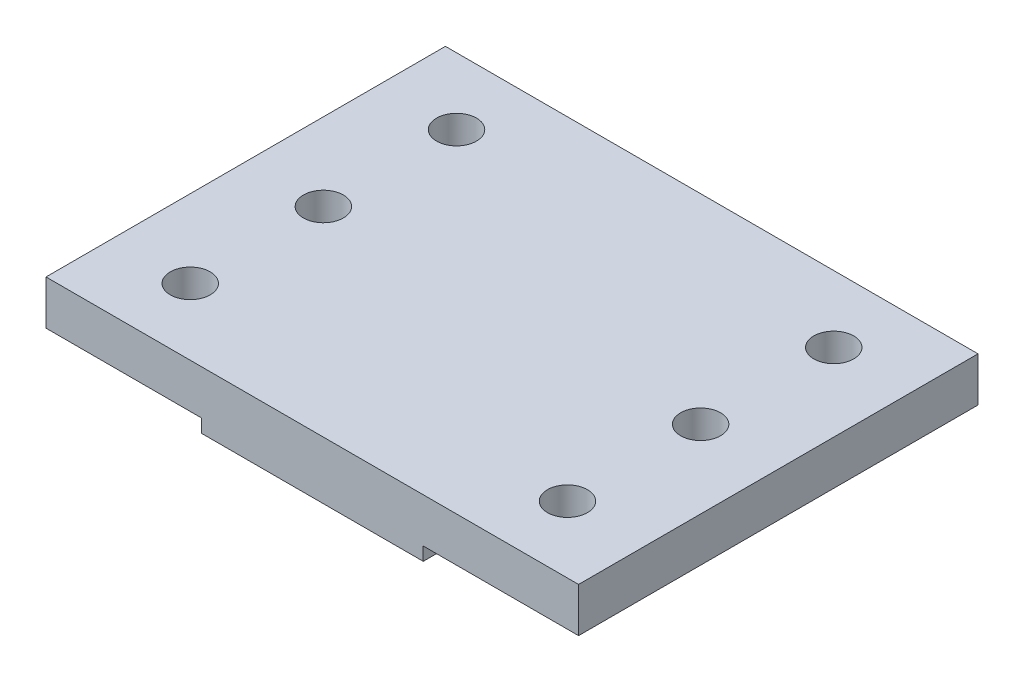
ISO-10303-21;
HEADER;
FILE_DESCRIPTION(('STEP AP214'),'2;1');
FILE_NAME('part.step','',(''),(''),'','','');
FILE_SCHEMA(('AUTOMOTIVE_DESIGN { 1 0 10303 214 1 1 1 1 }'));
ENDSEC;
DATA;
#1=APPLICATION_CONTEXT('core data for automotive mechanical design processes');
#2=APPLICATION_PROTOCOL_DEFINITION('international standard','automotive_design',2000,#1);
#3=PRODUCT_CONTEXT('',#1,'mechanical');
#4=PRODUCT('Part','Part','',(#3));
#5=PRODUCT_RELATED_PRODUCT_CATEGORY('part','',(#4));
#6=PRODUCT_DEFINITION_FORMATION('','',#4);
#7=PRODUCT_DEFINITION_CONTEXT('part definition',#1,'design');
#8=PRODUCT_DEFINITION('design','',#6,#7);
#9=PRODUCT_DEFINITION_SHAPE('','',#8);
#10=(LENGTH_UNIT() NAMED_UNIT(*) SI_UNIT(.MILLI.,.METRE.));
#11=(NAMED_UNIT(*) PLANE_ANGLE_UNIT() SI_UNIT($,.RADIAN.));
#12=(NAMED_UNIT(*) SI_UNIT($,.STERADIAN.) SOLID_ANGLE_UNIT());
#13=UNCERTAINTY_MEASURE_WITH_UNIT(LENGTH_MEASURE(1.E-05),#10,'distance_accuracy_value','');
#14=(GEOMETRIC_REPRESENTATION_CONTEXT(3) GLOBAL_UNCERTAINTY_ASSIGNED_CONTEXT((#13)) GLOBAL_UNIT_ASSIGNED_CONTEXT((#10,
#11,#12)) REPRESENTATION_CONTEXT('',''));
#15=CARTESIAN_POINT('',(0.,0.,0.));
#16=DIRECTION('',(0.,0.,1.));
#17=DIRECTION('',(1.,0.,0.));
#18=AXIS2_PLACEMENT_3D('',#15,#16,#17);
#19=CARTESIAN_POINT('',(-12.5,-2.5,45.));
#20=DIRECTION('',(0.,1.,0.));
#21=DIRECTION('',(-1.,0.,0.));
#22=AXIS2_PLACEMENT_3D('',#19,#20,#21);
#23=PLANE('',#22);
#24=CARTESIAN_POINT('',(-21.25,-2.5,37.5));
#25=DIRECTION('',(0.,1.,0.));
#26=DIRECTION('',(-1.,0.,0.));
#27=AXIS2_PLACEMENT_3D('',#24,#25,#26);
#28=CIRCLE('',#27,2.25);
#29=CARTESIAN_POINT('',(-23.5,-2.5,37.5));
#30=VERTEX_POINT('',#29);
#31=EDGE_CURVE('E185',#30,#30,#28,.T.);
#32=ORIENTED_EDGE('',*,*,#31,.T.);
#33=EDGE_LOOP('',(#32));
#34=FACE_BOUND('',#33,.T.);
#35=CARTESIAN_POINT('',(-21.25,-2.5,22.5));
#36=DIRECTION('',(0.,1.,0.));
#37=DIRECTION('',(-1.,0.,0.));
#38=AXIS2_PLACEMENT_3D('',#35,#36,#37);
#39=CIRCLE('',#38,2.25);
#40=CARTESIAN_POINT('',(-23.5,-2.5,22.5));
#41=VERTEX_POINT('',#40);
#42=EDGE_CURVE('E188',#41,#41,#39,.T.);
#43=ORIENTED_EDGE('',*,*,#42,.T.);
#44=EDGE_LOOP('',(#43));
#45=FACE_BOUND('',#44,.T.);
#46=CARTESIAN_POINT('',(-21.25,-2.5,7.5));
#47=DIRECTION('',(0.,1.,0.));
#48=DIRECTION('',(-1.,0.,0.));
#49=AXIS2_PLACEMENT_3D('',#46,#47,#48);
#50=CIRCLE('',#49,2.25);
#51=CARTESIAN_POINT('',(-23.5,-2.5,7.5));
#52=VERTEX_POINT('',#51);
#53=EDGE_CURVE('E191',#52,#52,#50,.T.);
#54=ORIENTED_EDGE('',*,*,#53,.T.);
#55=EDGE_LOOP('',(#54));
#56=FACE_BOUND('',#55,.T.);
#57=DIRECTION('',(1.,0.,0.));
#58=VECTOR('',#57,1.);
#59=CARTESIAN_POINT('',(-12.5,-2.5,0.));
#60=LINE('',#59,#58);
#61=CARTESIAN_POINT('',(-30.,-2.5,0.));
#62=VERTEX_POINT('',#61);
#63=CARTESIAN_POINT('',(-12.5,-2.5,0.));
#64=VERTEX_POINT('',#63);
#65=EDGE_CURVE('E129',#62,#64,#60,.T.);
#66=ORIENTED_EDGE('',*,*,#65,.T.);
#67=DIRECTION('',(0.,0.,-1.));
#68=VECTOR('',#67,1.);
#69=CARTESIAN_POINT('',(-12.5,-2.5,45.));
#70=LINE('',#69,#68);
#71=CARTESIAN_POINT('',(-12.5,-2.5,45.));
#72=VERTEX_POINT('',#71);
#73=EDGE_CURVE('E11',#72,#64,#70,.T.);
#74=ORIENTED_EDGE('',*,*,#73,.F.);
#75=DIRECTION('',(1.,0.,0.));
#76=VECTOR('',#75,1.);
#77=CARTESIAN_POINT('',(-12.5,-2.5,45.));
#78=LINE('',#77,#76);
#79=CARTESIAN_POINT('',(-30.,-2.5,45.));
#80=VERTEX_POINT('',#79);
#81=EDGE_CURVE('E144',#80,#72,#78,.T.);
#82=ORIENTED_EDGE('',*,*,#81,.F.);
#83=DIRECTION('',(0.,0.,-1.));
#84=VECTOR('',#83,1.);
#85=CARTESIAN_POINT('',(-30.,-2.5,45.));
#86=LINE('',#85,#84);
#87=EDGE_CURVE('E125',#80,#62,#86,.T.);
#88=ORIENTED_EDGE('',*,*,#87,.T.);
#89=EDGE_LOOP('',(#66,#74,#82,#88));
#90=FACE_BOUND('',#89,.T.);
#91=ADVANCED_FACE('F33',(#34,#45,#56,#90),#23,.F.);
#92=CARTESIAN_POINT('',(-12.5,-2.5,45.));
#93=DIRECTION('',(1.,0.,0.));
#94=DIRECTION('',(0.,0.,-1.));
#95=AXIS2_PLACEMENT_3D('',#92,#93,#94);
#96=PLANE('',#95);
#97=DIRECTION('',(0.,-1.,0.));
#98=VECTOR('',#97,1.);
#99=CARTESIAN_POINT('',(-12.5,-2.5,0.));
#100=LINE('',#99,#98);
#101=CARTESIAN_POINT('',(-12.5,-4.,0.));
#102=VERTEX_POINT('',#101);
#103=EDGE_CURVE('E132',#64,#102,#100,.T.);
#104=ORIENTED_EDGE('',*,*,#103,.T.);
#105=DIRECTION('',(0.,0.,-1.));
#106=VECTOR('',#105,1.);
#107=CARTESIAN_POINT('',(-12.5,-4.,45.));
#108=LINE('',#107,#106);
#109=CARTESIAN_POINT('',(-12.5,-4.,45.));
#110=VERTEX_POINT('',#109);
#111=EDGE_CURVE('E41',#110,#102,#108,.T.);
#112=ORIENTED_EDGE('',*,*,#111,.F.);
#113=DIRECTION('',(0.,-1.,0.));
#114=VECTOR('',#113,1.);
#115=CARTESIAN_POINT('',(-12.5,-2.5,45.));
#116=LINE('',#115,#114);
#117=EDGE_CURVE('E92',#72,#110,#116,.T.);
#118=ORIENTED_EDGE('',*,*,#117,.F.);
#119=ORIENTED_EDGE('',*,*,#73,.T.);
#120=EDGE_LOOP('',(#104,#112,#118,#119));
#121=FACE_BOUND('',#120,.T.);
#122=ADVANCED_FACE('F231',(#121),#96,.F.);
#123=CARTESIAN_POINT('',(-12.5,-4.,45.));
#124=DIRECTION('',(0.,1.,0.));
#125=DIRECTION('',(0.,0.,1.));
#126=AXIS2_PLACEMENT_3D('',#123,#124,#125);
#127=PLANE('',#126);
#128=DIRECTION('',(1.,0.,0.));
#129=VECTOR('',#128,1.);
#130=CARTESIAN_POINT('',(-12.5,-4.,0.));
#131=LINE('',#130,#129);
#132=CARTESIAN_POINT('',(12.5,-4.,0.));
#133=VERTEX_POINT('',#132);
#134=EDGE_CURVE('E135',#102,#133,#131,.T.);
#135=ORIENTED_EDGE('',*,*,#134,.T.);
#136=DIRECTION('',(0.,0.,-1.));
#137=VECTOR('',#136,1.);
#138=CARTESIAN_POINT('',(12.5,-4.,45.));
#139=LINE('',#138,#137);
#140=CARTESIAN_POINT('',(12.5,-4.,45.));
#141=VERTEX_POINT('',#140);
#142=EDGE_CURVE('E151',#141,#133,#139,.T.);
#143=ORIENTED_EDGE('',*,*,#142,.F.);
#144=DIRECTION('',(1.,0.,0.));
#145=VECTOR('',#144,1.);
#146=CARTESIAN_POINT('',(-12.5,-4.,45.));
#147=LINE('',#146,#145);
#148=EDGE_CURVE('E159',#110,#141,#147,.T.);
#149=ORIENTED_EDGE('',*,*,#148,.F.);
#150=ORIENTED_EDGE('',*,*,#111,.T.);
#151=EDGE_LOOP('',(#135,#143,#149,#150));
#152=FACE_BOUND('',#151,.T.);
#153=ADVANCED_FACE('F157',(#152),#127,.F.);
#154=CARTESIAN_POINT('',(12.5,-4.,45.));
#155=DIRECTION('',(-1.,0.,0.));
#156=DIRECTION('',(0.,0.,1.));
#157=AXIS2_PLACEMENT_3D('',#154,#155,#156);
#158=PLANE('',#157);
#159=DIRECTION('',(0.,1.,0.));
#160=VECTOR('',#159,1.);
#161=CARTESIAN_POINT('',(12.5,-4.,0.));
#162=LINE('',#161,#160);
#163=CARTESIAN_POINT('',(12.5,-2.5,0.));
#164=VERTEX_POINT('',#163);
#165=EDGE_CURVE('E137',#133,#164,#162,.T.);
#166=ORIENTED_EDGE('',*,*,#165,.T.);
#167=DIRECTION('',(0.,0.,-1.));
#168=VECTOR('',#167,1.);
#169=CARTESIAN_POINT('',(12.5,-2.5,45.));
#170=LINE('',#169,#168);
#171=CARTESIAN_POINT('',(12.5,-2.5,45.));
#172=VERTEX_POINT('',#171);
#173=EDGE_CURVE('E148',#172,#164,#170,.T.);
#174=ORIENTED_EDGE('',*,*,#173,.F.);
#175=DIRECTION('',(0.,1.,0.));
#176=VECTOR('',#175,1.);
#177=CARTESIAN_POINT('',(12.5,-4.,45.));
#178=LINE('',#177,#176);
#179=EDGE_CURVE('E171',#141,#172,#178,.T.);
#180=ORIENTED_EDGE('',*,*,#179,.F.);
#181=ORIENTED_EDGE('',*,*,#142,.T.);
#182=EDGE_LOOP('',(#166,#174,#180,#181));
#183=FACE_BOUND('',#182,.T.);
#184=ADVANCED_FACE('F167',(#183),#158,.F.);
#185=CARTESIAN_POINT('',(30.,-2.5,45.));
#186=DIRECTION('',(0.,1.,0.));
#187=DIRECTION('',(-1.,0.,0.));
#188=AXIS2_PLACEMENT_3D('',#185,#186,#187);
#189=PLANE('',#188);
#190=CARTESIAN_POINT('',(21.25,-2.5,7.5));
#191=DIRECTION('',(0.,1.,0.));
#192=DIRECTION('',(-1.,0.,0.));
#193=AXIS2_PLACEMENT_3D('',#190,#191,#192);
#194=CIRCLE('',#193,2.25);
#195=CARTESIAN_POINT('',(19.,-2.5,7.5));
#196=VERTEX_POINT('',#195);
#197=EDGE_CURVE('E133',#196,#196,#194,.T.);
#198=ORIENTED_EDGE('',*,*,#197,.T.);
#199=EDGE_LOOP('',(#198));
#200=FACE_BOUND('',#199,.T.);
#201=CARTESIAN_POINT('',(21.25,-2.5,22.5));
#202=DIRECTION('',(0.,1.,0.));
#203=DIRECTION('',(-1.,0.,0.));
#204=AXIS2_PLACEMENT_3D('',#201,#202,#203);
#205=CIRCLE('',#204,2.25);
#206=CARTESIAN_POINT('',(19.,-2.5,22.5));
#207=VERTEX_POINT('',#206);
#208=EDGE_CURVE('E179',#207,#207,#205,.T.);
#209=ORIENTED_EDGE('',*,*,#208,.T.);
#210=EDGE_LOOP('',(#209));
#211=FACE_BOUND('',#210,.T.);
#212=CARTESIAN_POINT('',(21.25,-2.5,37.5));
#213=DIRECTION('',(0.,1.,0.));
#214=DIRECTION('',(-1.,0.,0.));
#215=AXIS2_PLACEMENT_3D('',#212,#213,#214);
#216=CIRCLE('',#215,2.25);
#217=CARTESIAN_POINT('',(19.,-2.5,37.5));
#218=VERTEX_POINT('',#217);
#219=EDGE_CURVE('E182',#218,#218,#216,.T.);
#220=ORIENTED_EDGE('',*,*,#219,.T.);
#221=EDGE_LOOP('',(#220));
#222=FACE_BOUND('',#221,.T.);
#223=DIRECTION('',(1.,0.,0.));
#224=VECTOR('',#223,1.);
#225=CARTESIAN_POINT('',(30.,-2.5,0.));
#226=LINE('',#225,#224);
#227=CARTESIAN_POINT('',(30.,-2.5,0.));
#228=VERTEX_POINT('',#227);
#229=EDGE_CURVE('E139',#164,#228,#226,.T.);
#230=ORIENTED_EDGE('',*,*,#229,.T.);
#231=DIRECTION('',(0.,0.,-1.));
#232=VECTOR('',#231,1.);
#233=CARTESIAN_POINT('',(30.,-2.5,45.));
#234=LINE('',#233,#232);
#235=CARTESIAN_POINT('',(30.,-2.5,45.));
#236=VERTEX_POINT('',#235);
#237=EDGE_CURVE('E120',#236,#228,#234,.T.);
#238=ORIENTED_EDGE('',*,*,#237,.F.);
#239=DIRECTION('',(1.,0.,0.));
#240=VECTOR('',#239,1.);
#241=CARTESIAN_POINT('',(30.,-2.5,45.));
#242=LINE('',#241,#240);
#243=EDGE_CURVE('E111',#172,#236,#242,.T.);
#244=ORIENTED_EDGE('',*,*,#243,.F.);
#245=ORIENTED_EDGE('',*,*,#173,.T.);
#246=EDGE_LOOP('',(#230,#238,#244,#245));
#247=FACE_BOUND('',#246,.T.);
#248=ADVANCED_FACE('F170',(#200,#211,#222,#247),#189,.F.);
#249=CARTESIAN_POINT('',(30.,2.5,45.));
#250=DIRECTION('',(-1.,0.,0.));
#251=DIRECTION('',(0.,0.,1.));
#252=AXIS2_PLACEMENT_3D('',#249,#250,#251);
#253=PLANE('',#252);
#254=DIRECTION('',(0.,1.,0.));
#255=VECTOR('',#254,1.);
#256=CARTESIAN_POINT('',(30.,2.5,0.));
#257=LINE('',#256,#255);
#258=CARTESIAN_POINT('',(30.,2.5,0.));
#259=VERTEX_POINT('',#258);
#260=EDGE_CURVE('E119',#228,#259,#257,.T.);
#261=ORIENTED_EDGE('',*,*,#260,.T.);
#262=DIRECTION('',(0.,0.,-1.));
#263=VECTOR('',#262,1.);
#264=CARTESIAN_POINT('',(30.,2.5,45.));
#265=LINE('',#264,#263);
#266=CARTESIAN_POINT('',(30.,2.5,45.));
#267=VERTEX_POINT('',#266);
#268=EDGE_CURVE('E116',#267,#259,#265,.T.);
#269=ORIENTED_EDGE('',*,*,#268,.F.);
#270=DIRECTION('',(0.,1.,0.));
#271=VECTOR('',#270,1.);
#272=CARTESIAN_POINT('',(30.,2.5,45.));
#273=LINE('',#272,#271);
#274=EDGE_CURVE('E105',#236,#267,#273,.T.);
#275=ORIENTED_EDGE('',*,*,#274,.F.);
#276=ORIENTED_EDGE('',*,*,#237,.T.);
#277=EDGE_LOOP('',(#261,#269,#275,#276));
#278=FACE_BOUND('',#277,.T.);
#279=ADVANCED_FACE('F117',(#278),#253,.F.);
#280=CARTESIAN_POINT('',(30.,2.5,45.));
#281=DIRECTION('',(0.,-1.,0.));
#282=DIRECTION('',(1.,0.,0.));
#283=AXIS2_PLACEMENT_3D('',#280,#281,#282);
#284=PLANE('',#283);
#285=CARTESIAN_POINT('',(21.25,2.5,7.5));
#286=DIRECTION('',(0.,1.,0.));
#287=DIRECTION('',(-1.,0.,0.));
#288=AXIS2_PLACEMENT_3D('',#285,#286,#287);
#289=CIRCLE('',#288,2.25);
#290=CARTESIAN_POINT('',(19.,2.5,7.5));
#291=VERTEX_POINT('',#290);
#292=EDGE_CURVE('E198',#291,#291,#289,.T.);
#293=ORIENTED_EDGE('',*,*,#292,.F.);
#294=EDGE_LOOP('',(#293));
#295=FACE_BOUND('',#294,.T.);
#296=CARTESIAN_POINT('',(21.25,2.5,22.5));
#297=DIRECTION('',(0.,1.,0.));
#298=DIRECTION('',(-1.,0.,0.));
#299=AXIS2_PLACEMENT_3D('',#296,#297,#298);
#300=CIRCLE('',#299,2.25);
#301=CARTESIAN_POINT('',(19.,2.5,22.5));
#302=VERTEX_POINT('',#301);
#303=EDGE_CURVE('E201',#302,#302,#300,.T.);
#304=ORIENTED_EDGE('',*,*,#303,.F.);
#305=EDGE_LOOP('',(#304));
#306=FACE_BOUND('',#305,.T.);
#307=CARTESIAN_POINT('',(21.25,2.5,37.5));
#308=DIRECTION('',(0.,1.,0.));
#309=DIRECTION('',(-1.,0.,0.));
#310=AXIS2_PLACEMENT_3D('',#307,#308,#309);
#311=CIRCLE('',#310,2.25);
#312=CARTESIAN_POINT('',(19.,2.5,37.5));
#313=VERTEX_POINT('',#312);
#314=EDGE_CURVE('E204',#313,#313,#311,.T.);
#315=ORIENTED_EDGE('',*,*,#314,.F.);
#316=EDGE_LOOP('',(#315));
#317=FACE_BOUND('',#316,.T.);
#318=CARTESIAN_POINT('',(-21.25,2.5,37.5));
#319=DIRECTION('',(0.,1.,0.));
#320=DIRECTION('',(-1.,0.,0.));
#321=AXIS2_PLACEMENT_3D('',#318,#319,#320);
#322=CIRCLE('',#321,2.25);
#323=CARTESIAN_POINT('',(-23.5,2.5,37.5));
#324=VERTEX_POINT('',#323);
#325=EDGE_CURVE('E207',#324,#324,#322,.T.);
#326=ORIENTED_EDGE('',*,*,#325,.F.);
#327=EDGE_LOOP('',(#326));
#328=FACE_BOUND('',#327,.T.);
#329=CARTESIAN_POINT('',(-21.25,2.5,22.5));
#330=DIRECTION('',(0.,1.,0.));
#331=DIRECTION('',(-1.,0.,0.));
#332=AXIS2_PLACEMENT_3D('',#329,#330,#331);
#333=CIRCLE('',#332,2.25);
#334=CARTESIAN_POINT('',(-23.5,2.5,22.5));
#335=VERTEX_POINT('',#334);
#336=EDGE_CURVE('E197',#335,#335,#333,.T.);
#337=ORIENTED_EDGE('',*,*,#336,.F.);
#338=EDGE_LOOP('',(#337));
#339=FACE_BOUND('',#338,.T.);
#340=CARTESIAN_POINT('',(-21.25,2.5,7.5));
#341=DIRECTION('',(0.,1.,0.));
#342=DIRECTION('',(-1.,0.,0.));
#343=AXIS2_PLACEMENT_3D('',#340,#341,#342);
#344=CIRCLE('',#343,2.25);
#345=CARTESIAN_POINT('',(-23.5,2.5,7.5));
#346=VERTEX_POINT('',#345);
#347=EDGE_CURVE('E194',#346,#346,#344,.T.);
#348=ORIENTED_EDGE('',*,*,#347,.F.);
#349=EDGE_LOOP('',(#348));
#350=FACE_BOUND('',#349,.T.);
#351=DIRECTION('',(-1.,0.,0.));
#352=VECTOR('',#351,1.);
#353=CARTESIAN_POINT('',(30.,2.5,0.));
#354=LINE('',#353,#352);
#355=CARTESIAN_POINT('',(-30.,2.5,0.));
#356=VERTEX_POINT('',#355);
#357=EDGE_CURVE('E78',#259,#356,#354,.T.);
#358=ORIENTED_EDGE('',*,*,#357,.T.);
#359=DIRECTION('',(0.,0.,-1.));
#360=VECTOR('',#359,1.);
#361=CARTESIAN_POINT('',(-30.,2.5,45.));
#362=LINE('',#361,#360);
#363=CARTESIAN_POINT('',(-30.,2.5,45.));
#364=VERTEX_POINT('',#363);
#365=EDGE_CURVE('E121',#364,#356,#362,.T.);
#366=ORIENTED_EDGE('',*,*,#365,.F.);
#367=DIRECTION('',(-1.,0.,0.));
#368=VECTOR('',#367,1.);
#369=CARTESIAN_POINT('',(30.,2.5,45.));
#370=LINE('',#369,#368);
#371=EDGE_CURVE('E109',#267,#364,#370,.T.);
#372=ORIENTED_EDGE('',*,*,#371,.F.);
#373=ORIENTED_EDGE('',*,*,#268,.T.);
#374=EDGE_LOOP('',(#358,#366,#372,#373));
#375=FACE_BOUND('',#374,.T.);
#376=ADVANCED_FACE('F123',(#295,#306,#317,#328,#339,#350,#375),#284,.F.);
#377=CARTESIAN_POINT('',(-30.,2.5,45.));
#378=DIRECTION('',(1.,0.,0.));
#379=DIRECTION('',(0.,0.,-1.));
#380=AXIS2_PLACEMENT_3D('',#377,#378,#379);
#381=PLANE('',#380);
#382=DIRECTION('',(0.,-1.,0.));
#383=VECTOR('',#382,1.);
#384=CARTESIAN_POINT('',(-30.,2.5,0.));
#385=LINE('',#384,#383);
#386=EDGE_CURVE('E84',#356,#62,#385,.T.);
#387=ORIENTED_EDGE('',*,*,#386,.T.);
#388=ORIENTED_EDGE('',*,*,#87,.F.);
#389=DIRECTION('',(0.,-1.,0.));
#390=VECTOR('',#389,1.);
#391=CARTESIAN_POINT('',(-30.,2.5,45.));
#392=LINE('',#391,#390);
#393=EDGE_CURVE('E49',#364,#80,#392,.T.);
#394=ORIENTED_EDGE('',*,*,#393,.F.);
#395=ORIENTED_EDGE('',*,*,#365,.T.);
#396=EDGE_LOOP('',(#387,#388,#394,#395));
#397=FACE_BOUND('',#396,.T.);
#398=ADVANCED_FACE('F218',(#397),#381,.F.);
#399=CARTESIAN_POINT('',(0.,0.,45.));
#400=DIRECTION('',(0.,0.,1.));
#401=DIRECTION('',(1.,0.,0.));
#402=AXIS2_PLACEMENT_3D('',#399,#400,#401);
#403=PLANE('',#402);
#404=ORIENTED_EDGE('',*,*,#81,.T.);
#405=ORIENTED_EDGE('',*,*,#117,.T.);
#406=ORIENTED_EDGE('',*,*,#148,.T.);
#407=ORIENTED_EDGE('',*,*,#179,.T.);
#408=ORIENTED_EDGE('',*,*,#243,.T.);
#409=ORIENTED_EDGE('',*,*,#274,.T.);
#410=ORIENTED_EDGE('',*,*,#371,.T.);
#411=ORIENTED_EDGE('',*,*,#393,.T.);
#412=EDGE_LOOP('',(#404,#405,#406,#407,#408,#409,#410,#411));
#413=FACE_BOUND('',#412,.T.);
#414=ADVANCED_FACE('F107',(#413),#403,.T.);
#415=CARTESIAN_POINT('',(0.,0.,0.));
#416=DIRECTION('',(0.,0.,1.));
#417=DIRECTION('',(1.,0.,0.));
#418=AXIS2_PLACEMENT_3D('',#415,#416,#417);
#419=PLANE('',#418);
#420=ORIENTED_EDGE('',*,*,#65,.F.);
#421=ORIENTED_EDGE('',*,*,#386,.F.);
#422=ORIENTED_EDGE('',*,*,#357,.F.);
#423=ORIENTED_EDGE('',*,*,#260,.F.);
#424=ORIENTED_EDGE('',*,*,#229,.F.);
#425=ORIENTED_EDGE('',*,*,#165,.F.);
#426=ORIENTED_EDGE('',*,*,#134,.F.);
#427=ORIENTED_EDGE('',*,*,#103,.F.);
#428=EDGE_LOOP('',(#420,#421,#422,#423,#424,#425,#426,#427));
#429=FACE_BOUND('',#428,.T.);
#430=ADVANCED_FACE('F163',(#429),#419,.F.);
#431=CARTESIAN_POINT('',(-21.25,-4.,7.5));
#432=DIRECTION('',(0.,1.,0.));
#433=DIRECTION('',(-1.,0.,0.));
#434=AXIS2_PLACEMENT_3D('',#431,#432,#433);
#435=CYLINDRICAL_SURFACE('',#434,2.25);
#436=CARTESIAN_POINT('',(-23.5,2.5,7.5));
#437=CARTESIAN_POINT('',(-23.5,2.44791666666666,7.5));
#438=CARTESIAN_POINT('',(-23.5,2.39583333333333,7.5));
#439=CARTESIAN_POINT('',(-23.5,2.29166666666666,7.5));
#440=CARTESIAN_POINT('',(-23.5,2.23958333333333,7.5));
#441=CARTESIAN_POINT('',(-23.5,2.13541666666666,7.5));
#442=CARTESIAN_POINT('',(-23.5,2.08333333333333,7.5));
#443=CARTESIAN_POINT('',(-23.5,1.97916666666666,7.5));
#444=CARTESIAN_POINT('',(-23.5,1.92708333333333,7.5));
#445=CARTESIAN_POINT('',(-23.5,1.82291666666666,7.5));
#446=CARTESIAN_POINT('',(-23.5,1.77083333333333,7.5));
#447=CARTESIAN_POINT('',(-23.5,1.66666666666666,7.5));
#448=CARTESIAN_POINT('',(-23.5,1.61458333333333,7.5));
#449=CARTESIAN_POINT('',(-23.5,1.51041666666666,7.5));
#450=CARTESIAN_POINT('',(-23.5,1.45833333333333,7.5));
#451=CARTESIAN_POINT('',(-23.5,1.35416666666666,7.5));
#452=CARTESIAN_POINT('',(-23.5,1.30208333333333,7.5));
#453=CARTESIAN_POINT('',(-23.5,1.19791666666666,7.5));
#454=CARTESIAN_POINT('',(-23.5,1.14583333333333,7.5));
#455=CARTESIAN_POINT('',(-23.5,1.04166666666666,7.5));
#456=CARTESIAN_POINT('',(-23.5,0.989583333333331,7.5));
#457=CARTESIAN_POINT('',(-23.5,0.885416666666664,7.5));
#458=CARTESIAN_POINT('',(-23.5,0.833333333333331,7.5));
#459=CARTESIAN_POINT('',(-23.5,0.729166666666665,7.5));
#460=CARTESIAN_POINT('',(-23.5,0.677083333333331,7.5));
#461=CARTESIAN_POINT('',(-23.5,0.572916666666665,7.5));
#462=CARTESIAN_POINT('',(-23.5,0.520833333333331,7.5));
#463=CARTESIAN_POINT('',(-23.5,0.416666666666664,7.5));
#464=CARTESIAN_POINT('',(-23.5,0.364583333333331,7.5));
#465=CARTESIAN_POINT('',(-23.5,0.260416666666664,7.5));
#466=CARTESIAN_POINT('',(-23.5,0.208333333333331,7.5));
#467=CARTESIAN_POINT('',(-23.5,0.104166666666664,7.5));
#468=CARTESIAN_POINT('',(-23.5,0.0520833333333308,7.5));
#469=CARTESIAN_POINT('',(-23.5,-0.0520833333333358,7.5));
#470=CARTESIAN_POINT('',(-23.5,-0.104166666666669,7.5));
#471=CARTESIAN_POINT('',(-23.5,-0.208333333333336,7.5));
#472=CARTESIAN_POINT('',(-23.5,-0.260416666666669,7.5));
#473=CARTESIAN_POINT('',(-23.5,-0.364583333333336,7.5));
#474=CARTESIAN_POINT('',(-23.5,-0.416666666666669,7.5));
#475=CARTESIAN_POINT('',(-23.5,-0.520833333333335,7.5));
#476=CARTESIAN_POINT('',(-23.5,-0.572916666666669,7.5));
#477=CARTESIAN_POINT('',(-23.5,-0.677083333333336,7.5));
#478=CARTESIAN_POINT('',(-23.5,-0.729166666666669,7.5));
#479=CARTESIAN_POINT('',(-23.5,-0.833333333333336,7.5));
#480=CARTESIAN_POINT('',(-23.5,-0.885416666666669,7.5));
#481=CARTESIAN_POINT('',(-23.5,-0.989583333333336,7.5));
#482=CARTESIAN_POINT('',(-23.5,-1.04166666666667,7.5));
#483=CARTESIAN_POINT('',(-23.5,-1.14583333333334,7.5));
#484=CARTESIAN_POINT('',(-23.5,-1.19791666666667,7.5));
#485=CARTESIAN_POINT('',(-23.5,-1.30208333333334,7.5));
#486=CARTESIAN_POINT('',(-23.5,-1.35416666666667,7.5));
#487=CARTESIAN_POINT('',(-23.5,-1.45833333333334,7.5));
#488=CARTESIAN_POINT('',(-23.5,-1.51041666666667,7.5));
#489=CARTESIAN_POINT('',(-23.5,-1.61458333333334,7.5));
#490=CARTESIAN_POINT('',(-23.5,-1.66666666666667,7.5));
#491=CARTESIAN_POINT('',(-23.5,-1.77083333333334,7.5));
#492=CARTESIAN_POINT('',(-23.5,-1.82291666666667,7.5));
#493=CARTESIAN_POINT('',(-23.5,-1.92708333333334,7.5));
#494=CARTESIAN_POINT('',(-23.5,-1.97916666666667,7.5));
#495=CARTESIAN_POINT('',(-23.5,-2.08333333333334,7.5));
#496=CARTESIAN_POINT('',(-23.5,-2.13541666666667,7.5));
#497=CARTESIAN_POINT('',(-23.5,-2.23958333333334,7.5));
#498=CARTESIAN_POINT('',(-23.5,-2.29166666666667,7.5));
#499=CARTESIAN_POINT('',(-23.5,-2.39583333333334,7.5));
#500=CARTESIAN_POINT('',(-23.5,-2.44791666666667,7.5));
#501=CARTESIAN_POINT('',(-23.5,-2.5,7.5));
#502=B_SPLINE_CURVE_WITH_KNOTS('',3,(#436,#437,#438,#439,#440,#441,#442,#443,#444,#445,#446,
#447,#448,#449,#450,#451,#452,#453,#454,#455,#456,#457,#458,#459,#460,#461,#462,#463,#464,#465,
#466,#467,#468,#469,#470,#471,#472,#473,#474,#475,#476,#477,#478,#479,#480,#481,#482,#483,#484,
#485,#486,#487,#488,#489,#490,#491,#492,#493,#494,#495,#496,#497,#498,#499,#500,#501),
.UNSPECIFIED.,.F.,.F.,(4,2,2,2,2,2,2,2,2,2,2,2,2,2,2,2,2,2,2,2,2,2,2,2,2,2,2,2,2,2,2,2,4),(0.,
0.15625,0.3125,0.46875,0.625000000000001,0.78125,0.9375,1.09375,1.25,1.40625,1.5625,1.71875,
1.875,2.03125,2.1875,2.34375,2.5,2.65625,2.8125,2.96875,3.125,3.28125,3.4375,3.59375,3.75,
3.90625,4.0625,4.21875,4.375,4.53125,4.6875,4.84375,5.),.UNSPECIFIED.);
#503=EDGE_CURVE('BSEAM223',#346,#52,#502,.T.);
#504=ORIENTED_EDGE('',*,*,#347,.T.);
#505=ORIENTED_EDGE('',*,*,#53,.F.);
#506=ORIENTED_EDGE('',*,*,#503,.T.);
#507=ORIENTED_EDGE('',*,*,#503,.F.);
#508=EDGE_LOOP('',(#504,#506,#505,#507));
#509=FACE_BOUND('',#508,.T.);
#510=ADVANCED_FACE('F223',(#509),#435,.F.);
#511=CARTESIAN_POINT('',(-21.25,-4.,22.5));
#512=DIRECTION('',(0.,1.,0.));
#513=DIRECTION('',(-1.,0.,0.));
#514=AXIS2_PLACEMENT_3D('',#511,#512,#513);
#515=CYLINDRICAL_SURFACE('',#514,2.25);
#516=CARTESIAN_POINT('',(-23.5,2.5,22.5));
#517=CARTESIAN_POINT('',(-23.5,2.44791666666666,22.5));
#518=CARTESIAN_POINT('',(-23.5,2.39583333333333,22.5));
#519=CARTESIAN_POINT('',(-23.5,2.29166666666666,22.5));
#520=CARTESIAN_POINT('',(-23.5,2.23958333333333,22.5));
#521=CARTESIAN_POINT('',(-23.5,2.13541666666666,22.5));
#522=CARTESIAN_POINT('',(-23.5,2.08333333333333,22.5));
#523=CARTESIAN_POINT('',(-23.5,1.97916666666666,22.5));
#524=CARTESIAN_POINT('',(-23.5,1.92708333333333,22.5));
#525=CARTESIAN_POINT('',(-23.5,1.82291666666666,22.5));
#526=CARTESIAN_POINT('',(-23.5,1.77083333333333,22.5));
#527=CARTESIAN_POINT('',(-23.5,1.66666666666666,22.5));
#528=CARTESIAN_POINT('',(-23.5,1.61458333333333,22.5));
#529=CARTESIAN_POINT('',(-23.5,1.51041666666666,22.5));
#530=CARTESIAN_POINT('',(-23.5,1.45833333333333,22.5));
#531=CARTESIAN_POINT('',(-23.5,1.35416666666666,22.5));
#532=CARTESIAN_POINT('',(-23.5,1.30208333333333,22.5));
#533=CARTESIAN_POINT('',(-23.5,1.19791666666666,22.5));
#534=CARTESIAN_POINT('',(-23.5,1.14583333333333,22.5));
#535=CARTESIAN_POINT('',(-23.5,1.04166666666666,22.5));
#536=CARTESIAN_POINT('',(-23.5,0.989583333333331,22.5));
#537=CARTESIAN_POINT('',(-23.5,0.885416666666664,22.5));
#538=CARTESIAN_POINT('',(-23.5,0.833333333333331,22.5));
#539=CARTESIAN_POINT('',(-23.5,0.729166666666665,22.5));
#540=CARTESIAN_POINT('',(-23.5,0.677083333333331,22.5));
#541=CARTESIAN_POINT('',(-23.5,0.572916666666665,22.5));
#542=CARTESIAN_POINT('',(-23.5,0.520833333333331,22.5));
#543=CARTESIAN_POINT('',(-23.5,0.416666666666664,22.5));
#544=CARTESIAN_POINT('',(-23.5,0.364583333333331,22.5));
#545=CARTESIAN_POINT('',(-23.5,0.260416666666664,22.5));
#546=CARTESIAN_POINT('',(-23.5,0.208333333333331,22.5));
#547=CARTESIAN_POINT('',(-23.5,0.104166666666664,22.5));
#548=CARTESIAN_POINT('',(-23.5,0.0520833333333308,22.5));
#549=CARTESIAN_POINT('',(-23.5,-0.0520833333333358,22.5));
#550=CARTESIAN_POINT('',(-23.5,-0.104166666666669,22.5));
#551=CARTESIAN_POINT('',(-23.5,-0.208333333333336,22.5));
#552=CARTESIAN_POINT('',(-23.5,-0.260416666666669,22.5));
#553=CARTESIAN_POINT('',(-23.5,-0.364583333333336,22.5));
#554=CARTESIAN_POINT('',(-23.5,-0.416666666666669,22.5));
#555=CARTESIAN_POINT('',(-23.5,-0.520833333333335,22.5));
#556=CARTESIAN_POINT('',(-23.5,-0.572916666666669,22.5));
#557=CARTESIAN_POINT('',(-23.5,-0.677083333333336,22.5));
#558=CARTESIAN_POINT('',(-23.5,-0.729166666666669,22.5));
#559=CARTESIAN_POINT('',(-23.5,-0.833333333333336,22.5));
#560=CARTESIAN_POINT('',(-23.5,-0.885416666666669,22.5));
#561=CARTESIAN_POINT('',(-23.5,-0.989583333333336,22.5));
#562=CARTESIAN_POINT('',(-23.5,-1.04166666666667,22.5));
#563=CARTESIAN_POINT('',(-23.5,-1.14583333333334,22.5));
#564=CARTESIAN_POINT('',(-23.5,-1.19791666666667,22.5));
#565=CARTESIAN_POINT('',(-23.5,-1.30208333333334,22.5));
#566=CARTESIAN_POINT('',(-23.5,-1.35416666666667,22.5));
#567=CARTESIAN_POINT('',(-23.5,-1.45833333333334,22.5));
#568=CARTESIAN_POINT('',(-23.5,-1.51041666666667,22.5));
#569=CARTESIAN_POINT('',(-23.5,-1.61458333333334,22.5));
#570=CARTESIAN_POINT('',(-23.5,-1.66666666666667,22.5));
#571=CARTESIAN_POINT('',(-23.5,-1.77083333333334,22.5));
#572=CARTESIAN_POINT('',(-23.5,-1.82291666666667,22.5));
#573=CARTESIAN_POINT('',(-23.5,-1.92708333333334,22.5));
#574=CARTESIAN_POINT('',(-23.5,-1.97916666666667,22.5));
#575=CARTESIAN_POINT('',(-23.5,-2.08333333333334,22.5));
#576=CARTESIAN_POINT('',(-23.5,-2.13541666666667,22.5));
#577=CARTESIAN_POINT('',(-23.5,-2.23958333333334,22.5));
#578=CARTESIAN_POINT('',(-23.5,-2.29166666666667,22.5));
#579=CARTESIAN_POINT('',(-23.5,-2.39583333333334,22.5));
#580=CARTESIAN_POINT('',(-23.5,-2.44791666666667,22.5));
#581=CARTESIAN_POINT('',(-23.5,-2.5,22.5));
#582=B_SPLINE_CURVE_WITH_KNOTS('',3,(#516,#517,#518,#519,#520,#521,#522,#523,#524,#525,#526,
#527,#528,#529,#530,#531,#532,#533,#534,#535,#536,#537,#538,#539,#540,#541,#542,#543,#544,#545,
#546,#547,#548,#549,#550,#551,#552,#553,#554,#555,#556,#557,#558,#559,#560,#561,#562,#563,#564,
#565,#566,#567,#568,#569,#570,#571,#572,#573,#574,#575,#576,#577,#578,#579,#580,#581),
.UNSPECIFIED.,.F.,.F.,(4,2,2,2,2,2,2,2,2,2,2,2,2,2,2,2,2,2,2,2,2,2,2,2,2,2,2,2,2,2,2,2,4),(0.,
0.15625,0.3125,0.46875,0.625000000000001,0.78125,0.9375,1.09375,1.25,1.40625,1.5625,1.71875,
1.875,2.03125,2.1875,2.34375,2.5,2.65625,2.8125,2.96875,3.125,3.28125,3.4375,3.59375,3.75,
3.90625,4.0625,4.21875,4.375,4.53125,4.6875,4.84375,5.),.UNSPECIFIED.);
#583=EDGE_CURVE('BSEAM213',#335,#41,#582,.T.);
#584=ORIENTED_EDGE('',*,*,#336,.T.);
#585=ORIENTED_EDGE('',*,*,#42,.F.);
#586=ORIENTED_EDGE('',*,*,#583,.T.);
#587=ORIENTED_EDGE('',*,*,#583,.F.);
#588=EDGE_LOOP('',(#584,#586,#585,#587));
#589=FACE_BOUND('',#588,.T.);
#590=ADVANCED_FACE('F213',(#589),#515,.F.);
#591=CARTESIAN_POINT('',(-21.25,-4.,37.5));
#592=DIRECTION('',(0.,1.,0.));
#593=DIRECTION('',(-1.,0.,0.));
#594=AXIS2_PLACEMENT_3D('',#591,#592,#593);
#595=CYLINDRICAL_SURFACE('',#594,2.25);
#596=CARTESIAN_POINT('',(-23.5,2.5,37.5));
#597=CARTESIAN_POINT('',(-23.5,2.44791666666666,37.5));
#598=CARTESIAN_POINT('',(-23.5,2.39583333333333,37.5));
#599=CARTESIAN_POINT('',(-23.5,2.29166666666666,37.5));
#600=CARTESIAN_POINT('',(-23.5,2.23958333333333,37.5));
#601=CARTESIAN_POINT('',(-23.5,2.13541666666666,37.5));
#602=CARTESIAN_POINT('',(-23.5,2.08333333333333,37.5));
#603=CARTESIAN_POINT('',(-23.5,1.97916666666666,37.5));
#604=CARTESIAN_POINT('',(-23.5,1.92708333333333,37.5));
#605=CARTESIAN_POINT('',(-23.5,1.82291666666666,37.5));
#606=CARTESIAN_POINT('',(-23.5,1.77083333333333,37.5));
#607=CARTESIAN_POINT('',(-23.5,1.66666666666666,37.5));
#608=CARTESIAN_POINT('',(-23.5,1.61458333333333,37.5));
#609=CARTESIAN_POINT('',(-23.5,1.51041666666666,37.5));
#610=CARTESIAN_POINT('',(-23.5,1.45833333333333,37.5));
#611=CARTESIAN_POINT('',(-23.5,1.35416666666666,37.5));
#612=CARTESIAN_POINT('',(-23.5,1.30208333333333,37.5));
#613=CARTESIAN_POINT('',(-23.5,1.19791666666666,37.5));
#614=CARTESIAN_POINT('',(-23.5,1.14583333333333,37.5));
#615=CARTESIAN_POINT('',(-23.5,1.04166666666666,37.5));
#616=CARTESIAN_POINT('',(-23.5,0.989583333333331,37.5));
#617=CARTESIAN_POINT('',(-23.5,0.885416666666664,37.5));
#618=CARTESIAN_POINT('',(-23.5,0.833333333333331,37.5));
#619=CARTESIAN_POINT('',(-23.5,0.729166666666665,37.5));
#620=CARTESIAN_POINT('',(-23.5,0.677083333333331,37.5));
#621=CARTESIAN_POINT('',(-23.5,0.572916666666665,37.5));
#622=CARTESIAN_POINT('',(-23.5,0.520833333333331,37.5));
#623=CARTESIAN_POINT('',(-23.5,0.416666666666664,37.5));
#624=CARTESIAN_POINT('',(-23.5,0.364583333333331,37.5));
#625=CARTESIAN_POINT('',(-23.5,0.260416666666664,37.5));
#626=CARTESIAN_POINT('',(-23.5,0.208333333333331,37.5));
#627=CARTESIAN_POINT('',(-23.5,0.104166666666664,37.5));
#628=CARTESIAN_POINT('',(-23.5,0.0520833333333308,37.5));
#629=CARTESIAN_POINT('',(-23.5,-0.0520833333333358,37.5));
#630=CARTESIAN_POINT('',(-23.5,-0.104166666666669,37.5));
#631=CARTESIAN_POINT('',(-23.5,-0.208333333333336,37.5));
#632=CARTESIAN_POINT('',(-23.5,-0.260416666666669,37.5));
#633=CARTESIAN_POINT('',(-23.5,-0.364583333333336,37.5));
#634=CARTESIAN_POINT('',(-23.5,-0.416666666666669,37.5));
#635=CARTESIAN_POINT('',(-23.5,-0.520833333333335,37.5));
#636=CARTESIAN_POINT('',(-23.5,-0.572916666666669,37.5));
#637=CARTESIAN_POINT('',(-23.5,-0.677083333333336,37.5));
#638=CARTESIAN_POINT('',(-23.5,-0.729166666666669,37.5));
#639=CARTESIAN_POINT('',(-23.5,-0.833333333333336,37.5));
#640=CARTESIAN_POINT('',(-23.5,-0.885416666666669,37.5));
#641=CARTESIAN_POINT('',(-23.5,-0.989583333333336,37.5));
#642=CARTESIAN_POINT('',(-23.5,-1.04166666666667,37.5));
#643=CARTESIAN_POINT('',(-23.5,-1.14583333333334,37.5));
#644=CARTESIAN_POINT('',(-23.5,-1.19791666666667,37.5));
#645=CARTESIAN_POINT('',(-23.5,-1.30208333333334,37.5));
#646=CARTESIAN_POINT('',(-23.5,-1.35416666666667,37.5));
#647=CARTESIAN_POINT('',(-23.5,-1.45833333333334,37.5));
#648=CARTESIAN_POINT('',(-23.5,-1.51041666666667,37.5));
#649=CARTESIAN_POINT('',(-23.5,-1.61458333333334,37.5));
#650=CARTESIAN_POINT('',(-23.5,-1.66666666666667,37.5));
#651=CARTESIAN_POINT('',(-23.5,-1.77083333333334,37.5));
#652=CARTESIAN_POINT('',(-23.5,-1.82291666666667,37.5));
#653=CARTESIAN_POINT('',(-23.5,-1.92708333333334,37.5));
#654=CARTESIAN_POINT('',(-23.5,-1.97916666666667,37.5));
#655=CARTESIAN_POINT('',(-23.5,-2.08333333333334,37.5));
#656=CARTESIAN_POINT('',(-23.5,-2.13541666666667,37.5));
#657=CARTESIAN_POINT('',(-23.5,-2.23958333333334,37.5));
#658=CARTESIAN_POINT('',(-23.5,-2.29166666666667,37.5));
#659=CARTESIAN_POINT('',(-23.5,-2.39583333333334,37.5));
#660=CARTESIAN_POINT('',(-23.5,-2.44791666666667,37.5));
#661=CARTESIAN_POINT('',(-23.5,-2.5,37.5));
#662=B_SPLINE_CURVE_WITH_KNOTS('',3,(#596,#597,#598,#599,#600,#601,#602,#603,#604,#605,#606,
#607,#608,#609,#610,#611,#612,#613,#614,#615,#616,#617,#618,#619,#620,#621,#622,#623,#624,#625,
#626,#627,#628,#629,#630,#631,#632,#633,#634,#635,#636,#637,#638,#639,#640,#641,#642,#643,#644,
#645,#646,#647,#648,#649,#650,#651,#652,#653,#654,#655,#656,#657,#658,#659,#660,#661),
.UNSPECIFIED.,.F.,.F.,(4,2,2,2,2,2,2,2,2,2,2,2,2,2,2,2,2,2,2,2,2,2,2,2,2,2,2,2,2,2,2,2,4),(0.,
0.15625,0.3125,0.46875,0.625000000000001,0.78125,0.9375,1.09375,1.25,1.40625,1.5625,1.71875,
1.875,2.03125,2.1875,2.34375,2.5,2.65625,2.8125,2.96875,3.125,3.28125,3.4375,3.59375,3.75,
3.90625,4.0625,4.21875,4.375,4.53125,4.6875,4.84375,5.),.UNSPECIFIED.);
#663=EDGE_CURVE('BSEAM294',#324,#30,#662,.T.);
#664=ORIENTED_EDGE('',*,*,#325,.T.);
#665=ORIENTED_EDGE('',*,*,#31,.F.);
#666=ORIENTED_EDGE('',*,*,#663,.T.);
#667=ORIENTED_EDGE('',*,*,#663,.F.);
#668=EDGE_LOOP('',(#664,#666,#665,#667));
#669=FACE_BOUND('',#668,.T.);
#670=ADVANCED_FACE('F294',(#669),#595,.F.);
#671=CARTESIAN_POINT('',(21.25,-4.,37.5));
#672=DIRECTION('',(0.,1.,0.));
#673=DIRECTION('',(-1.,0.,0.));
#674=AXIS2_PLACEMENT_3D('',#671,#672,#673);
#675=CYLINDRICAL_SURFACE('',#674,2.25);
#676=CARTESIAN_POINT('',(19.,2.5,37.5));
#677=CARTESIAN_POINT('',(19.,2.44791666666667,37.5));
#678=CARTESIAN_POINT('',(19.,2.39583333333334,37.5));
#679=CARTESIAN_POINT('',(19.,2.29166666666667,37.5));
#680=CARTESIAN_POINT('',(19.,2.23958333333334,37.5));
#681=CARTESIAN_POINT('',(19.,2.13541666666667,37.5));
#682=CARTESIAN_POINT('',(19.,2.08333333333334,37.5));
#683=CARTESIAN_POINT('',(19.,1.97916666666667,37.5));
#684=CARTESIAN_POINT('',(19.,1.92708333333334,37.5));
#685=CARTESIAN_POINT('',(19.,1.82291666666667,37.5));
#686=CARTESIAN_POINT('',(19.,1.77083333333334,37.5));
#687=CARTESIAN_POINT('',(19.,1.66666666666667,37.5));
#688=CARTESIAN_POINT('',(19.,1.61458333333334,37.5));
#689=CARTESIAN_POINT('',(19.,1.51041666666667,37.5));
#690=CARTESIAN_POINT('',(19.,1.45833333333334,37.5));
#691=CARTESIAN_POINT('',(19.,1.35416666666667,37.5));
#692=CARTESIAN_POINT('',(19.,1.30208333333334,37.5));
#693=CARTESIAN_POINT('',(19.,1.19791666666667,37.5));
#694=CARTESIAN_POINT('',(19.,1.14583333333334,37.5));
#695=CARTESIAN_POINT('',(19.,1.04166666666667,37.5));
#696=CARTESIAN_POINT('',(19.,0.989583333333336,37.5));
#697=CARTESIAN_POINT('',(19.,0.885416666666669,37.5));
#698=CARTESIAN_POINT('',(19.,0.833333333333336,37.5));
#699=CARTESIAN_POINT('',(19.,0.72916666666667,37.5));
#700=CARTESIAN_POINT('',(19.,0.677083333333336,37.5));
#701=CARTESIAN_POINT('',(19.,0.57291666666667,37.5));
#702=CARTESIAN_POINT('',(19.,0.520833333333336,37.5));
#703=CARTESIAN_POINT('',(19.,0.41666666666667,37.5));
#704=CARTESIAN_POINT('',(19.,0.364583333333336,37.5));
#705=CARTESIAN_POINT('',(19.,0.26041666666667,37.5));
#706=CARTESIAN_POINT('',(19.,0.208333333333336,37.5));
#707=CARTESIAN_POINT('',(19.,0.104166666666669,37.5));
#708=CARTESIAN_POINT('',(19.,0.052083333333336,37.5));
#709=CARTESIAN_POINT('',(19.,-0.0520833333333306,37.5));
#710=CARTESIAN_POINT('',(19.,-0.104166666666664,37.5));
#711=CARTESIAN_POINT('',(19.,-0.20833333333333,37.5));
#712=CARTESIAN_POINT('',(19.,-0.260416666666664,37.5));
#713=CARTESIAN_POINT('',(19.,-0.36458333333333,37.5));
#714=CARTESIAN_POINT('',(19.,-0.416666666666664,37.5));
#715=CARTESIAN_POINT('',(19.,-0.52083333333333,37.5));
#716=CARTESIAN_POINT('',(19.,-0.572916666666664,37.5));
#717=CARTESIAN_POINT('',(19.,-0.67708333333333,37.5));
#718=CARTESIAN_POINT('',(19.,-0.729166666666664,37.5));
#719=CARTESIAN_POINT('',(19.,-0.83333333333333,37.5));
#720=CARTESIAN_POINT('',(19.,-0.885416666666664,37.5));
#721=CARTESIAN_POINT('',(19.,-0.98958333333333,37.5));
#722=CARTESIAN_POINT('',(19.,-1.04166666666666,37.5));
#723=CARTESIAN_POINT('',(19.,-1.14583333333333,37.5));
#724=CARTESIAN_POINT('',(19.,-1.19791666666666,37.5));
#725=CARTESIAN_POINT('',(19.,-1.30208333333333,37.5));
#726=CARTESIAN_POINT('',(19.,-1.35416666666666,37.5));
#727=CARTESIAN_POINT('',(19.,-1.45833333333333,37.5));
#728=CARTESIAN_POINT('',(19.,-1.51041666666666,37.5));
#729=CARTESIAN_POINT('',(19.,-1.61458333333333,37.5));
#730=CARTESIAN_POINT('',(19.,-1.66666666666666,37.5));
#731=CARTESIAN_POINT('',(19.,-1.77083333333333,37.5));
#732=CARTESIAN_POINT('',(19.,-1.82291666666666,37.5));
#733=CARTESIAN_POINT('',(19.,-1.92708333333333,37.5));
#734=CARTESIAN_POINT('',(19.,-1.97916666666666,37.5));
#735=CARTESIAN_POINT('',(19.,-2.08333333333333,37.5));
#736=CARTESIAN_POINT('',(19.,-2.13541666666666,37.5));
#737=CARTESIAN_POINT('',(19.,-2.23958333333333,37.5));
#738=CARTESIAN_POINT('',(19.,-2.29166666666666,37.5));
#739=CARTESIAN_POINT('',(19.,-2.39583333333333,37.5));
#740=CARTESIAN_POINT('',(19.,-2.44791666666666,37.5));
#741=CARTESIAN_POINT('',(19.,-2.5,37.5));
#742=B_SPLINE_CURVE_WITH_KNOTS('',3,(#676,#677,#678,#679,#680,#681,#682,#683,#684,#685,#686,
#687,#688,#689,#690,#691,#692,#693,#694,#695,#696,#697,#698,#699,#700,#701,#702,#703,#704,#705,
#706,#707,#708,#709,#710,#711,#712,#713,#714,#715,#716,#717,#718,#719,#720,#721,#722,#723,#724,
#725,#726,#727,#728,#729,#730,#731,#732,#733,#734,#735,#736,#737,#738,#739,#740,#741),
.UNSPECIFIED.,.F.,.F.,(4,2,2,2,2,2,2,2,2,2,2,2,2,2,2,2,2,2,2,2,2,2,2,2,2,2,2,2,2,2,2,2,4),(0.,
0.15625,0.3125,0.46875,0.625000000000001,0.78125,0.9375,1.09375,1.25,1.40625,1.5625,1.71875,
1.875,2.03125,2.1875,2.34375,2.5,2.65625,2.8125,2.96875,3.125,3.28125,3.4375,3.59375,3.75,
3.90625,4.0625,4.21875,4.375,4.53125,4.6875,4.84375,5.),.UNSPECIFIED.);
#743=EDGE_CURVE('BSEAM303',#313,#218,#742,.T.);
#744=ORIENTED_EDGE('',*,*,#314,.T.);
#745=ORIENTED_EDGE('',*,*,#219,.F.);
#746=ORIENTED_EDGE('',*,*,#743,.T.);
#747=ORIENTED_EDGE('',*,*,#743,.F.);
#748=EDGE_LOOP('',(#744,#746,#745,#747));
#749=FACE_BOUND('',#748,.T.);
#750=ADVANCED_FACE('F303',(#749),#675,.F.);
#751=CARTESIAN_POINT('',(21.25,-4.,22.5));
#752=DIRECTION('',(0.,1.,0.));
#753=DIRECTION('',(-1.,0.,0.));
#754=AXIS2_PLACEMENT_3D('',#751,#752,#753);
#755=CYLINDRICAL_SURFACE('',#754,2.25);
#756=CARTESIAN_POINT('',(19.,2.5,22.5));
#757=CARTESIAN_POINT('',(19.,2.44791666666667,22.5));
#758=CARTESIAN_POINT('',(19.,2.39583333333334,22.5));
#759=CARTESIAN_POINT('',(19.,2.29166666666667,22.5));
#760=CARTESIAN_POINT('',(19.,2.23958333333334,22.5));
#761=CARTESIAN_POINT('',(19.,2.13541666666667,22.5));
#762=CARTESIAN_POINT('',(19.,2.08333333333334,22.5));
#763=CARTESIAN_POINT('',(19.,1.97916666666667,22.5));
#764=CARTESIAN_POINT('',(19.,1.92708333333334,22.5));
#765=CARTESIAN_POINT('',(19.,1.82291666666667,22.5));
#766=CARTESIAN_POINT('',(19.,1.77083333333334,22.5));
#767=CARTESIAN_POINT('',(19.,1.66666666666667,22.5));
#768=CARTESIAN_POINT('',(19.,1.61458333333334,22.5));
#769=CARTESIAN_POINT('',(19.,1.51041666666667,22.5));
#770=CARTESIAN_POINT('',(19.,1.45833333333334,22.5));
#771=CARTESIAN_POINT('',(19.,1.35416666666667,22.5));
#772=CARTESIAN_POINT('',(19.,1.30208333333334,22.5));
#773=CARTESIAN_POINT('',(19.,1.19791666666667,22.5));
#774=CARTESIAN_POINT('',(19.,1.14583333333334,22.5));
#775=CARTESIAN_POINT('',(19.,1.04166666666667,22.5));
#776=CARTESIAN_POINT('',(19.,0.989583333333336,22.5));
#777=CARTESIAN_POINT('',(19.,0.885416666666669,22.5));
#778=CARTESIAN_POINT('',(19.,0.833333333333336,22.5));
#779=CARTESIAN_POINT('',(19.,0.72916666666667,22.5));
#780=CARTESIAN_POINT('',(19.,0.677083333333336,22.5));
#781=CARTESIAN_POINT('',(19.,0.57291666666667,22.5));
#782=CARTESIAN_POINT('',(19.,0.520833333333336,22.5));
#783=CARTESIAN_POINT('',(19.,0.41666666666667,22.5));
#784=CARTESIAN_POINT('',(19.,0.364583333333336,22.5));
#785=CARTESIAN_POINT('',(19.,0.26041666666667,22.5));
#786=CARTESIAN_POINT('',(19.,0.208333333333336,22.5));
#787=CARTESIAN_POINT('',(19.,0.104166666666669,22.5));
#788=CARTESIAN_POINT('',(19.,0.052083333333336,22.5));
#789=CARTESIAN_POINT('',(19.,-0.0520833333333306,22.5));
#790=CARTESIAN_POINT('',(19.,-0.104166666666664,22.5));
#791=CARTESIAN_POINT('',(19.,-0.20833333333333,22.5));
#792=CARTESIAN_POINT('',(19.,-0.260416666666664,22.5));
#793=CARTESIAN_POINT('',(19.,-0.36458333333333,22.5));
#794=CARTESIAN_POINT('',(19.,-0.416666666666664,22.5));
#795=CARTESIAN_POINT('',(19.,-0.52083333333333,22.5));
#796=CARTESIAN_POINT('',(19.,-0.572916666666664,22.5));
#797=CARTESIAN_POINT('',(19.,-0.67708333333333,22.5));
#798=CARTESIAN_POINT('',(19.,-0.729166666666664,22.5));
#799=CARTESIAN_POINT('',(19.,-0.83333333333333,22.5));
#800=CARTESIAN_POINT('',(19.,-0.885416666666664,22.5));
#801=CARTESIAN_POINT('',(19.,-0.98958333333333,22.5));
#802=CARTESIAN_POINT('',(19.,-1.04166666666666,22.5));
#803=CARTESIAN_POINT('',(19.,-1.14583333333333,22.5));
#804=CARTESIAN_POINT('',(19.,-1.19791666666666,22.5));
#805=CARTESIAN_POINT('',(19.,-1.30208333333333,22.5));
#806=CARTESIAN_POINT('',(19.,-1.35416666666666,22.5));
#807=CARTESIAN_POINT('',(19.,-1.45833333333333,22.5));
#808=CARTESIAN_POINT('',(19.,-1.51041666666666,22.5));
#809=CARTESIAN_POINT('',(19.,-1.61458333333333,22.5));
#810=CARTESIAN_POINT('',(19.,-1.66666666666666,22.5));
#811=CARTESIAN_POINT('',(19.,-1.77083333333333,22.5));
#812=CARTESIAN_POINT('',(19.,-1.82291666666666,22.5));
#813=CARTESIAN_POINT('',(19.,-1.92708333333333,22.5));
#814=CARTESIAN_POINT('',(19.,-1.97916666666666,22.5));
#815=CARTESIAN_POINT('',(19.,-2.08333333333333,22.5));
#816=CARTESIAN_POINT('',(19.,-2.13541666666666,22.5));
#817=CARTESIAN_POINT('',(19.,-2.23958333333333,22.5));
#818=CARTESIAN_POINT('',(19.,-2.29166666666666,22.5));
#819=CARTESIAN_POINT('',(19.,-2.39583333333333,22.5));
#820=CARTESIAN_POINT('',(19.,-2.44791666666666,22.5));
#821=CARTESIAN_POINT('',(19.,-2.5,22.5));
#822=B_SPLINE_CURVE_WITH_KNOTS('',3,(#756,#757,#758,#759,#760,#761,#762,#763,#764,#765,#766,
#767,#768,#769,#770,#771,#772,#773,#774,#775,#776,#777,#778,#779,#780,#781,#782,#783,#784,#785,
#786,#787,#788,#789,#790,#791,#792,#793,#794,#795,#796,#797,#798,#799,#800,#801,#802,#803,#804,
#805,#806,#807,#808,#809,#810,#811,#812,#813,#814,#815,#816,#817,#818,#819,#820,#821),
.UNSPECIFIED.,.F.,.F.,(4,2,2,2,2,2,2,2,2,2,2,2,2,2,2,2,2,2,2,2,2,2,2,2,2,2,2,2,2,2,2,2,4),(0.,
0.15625,0.3125,0.46875,0.625000000000001,0.78125,0.9375,1.09375,1.25,1.40625,1.5625,1.71875,
1.875,2.03125,2.1875,2.34375,2.5,2.65625,2.8125,2.96875,3.125,3.28125,3.4375,3.59375,3.75,
3.90625,4.0625,4.21875,4.375,4.53125,4.6875,4.84375,5.),.UNSPECIFIED.);
#823=EDGE_CURVE('BSEAM313',#302,#207,#822,.T.);
#824=ORIENTED_EDGE('',*,*,#303,.T.);
#825=ORIENTED_EDGE('',*,*,#208,.F.);
#826=ORIENTED_EDGE('',*,*,#823,.T.);
#827=ORIENTED_EDGE('',*,*,#823,.F.);
#828=EDGE_LOOP('',(#824,#826,#825,#827));
#829=FACE_BOUND('',#828,.T.);
#830=ADVANCED_FACE('F313',(#829),#755,.F.);
#831=CARTESIAN_POINT('',(21.25,-4.,7.5));
#832=DIRECTION('',(0.,1.,0.));
#833=DIRECTION('',(-1.,0.,0.));
#834=AXIS2_PLACEMENT_3D('',#831,#832,#833);
#835=CYLINDRICAL_SURFACE('',#834,2.25);
#836=CARTESIAN_POINT('',(19.,2.5,7.5));
#837=CARTESIAN_POINT('',(19.,2.44791666666667,7.5));
#838=CARTESIAN_POINT('',(19.,2.39583333333334,7.5));
#839=CARTESIAN_POINT('',(19.,2.29166666666667,7.5));
#840=CARTESIAN_POINT('',(19.,2.23958333333334,7.5));
#841=CARTESIAN_POINT('',(19.,2.13541666666667,7.5));
#842=CARTESIAN_POINT('',(19.,2.08333333333334,7.5));
#843=CARTESIAN_POINT('',(19.,1.97916666666667,7.5));
#844=CARTESIAN_POINT('',(19.,1.92708333333334,7.5));
#845=CARTESIAN_POINT('',(19.,1.82291666666667,7.5));
#846=CARTESIAN_POINT('',(19.,1.77083333333334,7.5));
#847=CARTESIAN_POINT('',(19.,1.66666666666667,7.5));
#848=CARTESIAN_POINT('',(19.,1.61458333333334,7.5));
#849=CARTESIAN_POINT('',(19.,1.51041666666667,7.5));
#850=CARTESIAN_POINT('',(19.,1.45833333333334,7.5));
#851=CARTESIAN_POINT('',(19.,1.35416666666667,7.5));
#852=CARTESIAN_POINT('',(19.,1.30208333333334,7.5));
#853=CARTESIAN_POINT('',(19.,1.19791666666667,7.5));
#854=CARTESIAN_POINT('',(19.,1.14583333333334,7.5));
#855=CARTESIAN_POINT('',(19.,1.04166666666667,7.5));
#856=CARTESIAN_POINT('',(19.,0.989583333333336,7.5));
#857=CARTESIAN_POINT('',(19.,0.885416666666669,7.5));
#858=CARTESIAN_POINT('',(19.,0.833333333333336,7.5));
#859=CARTESIAN_POINT('',(19.,0.72916666666667,7.5));
#860=CARTESIAN_POINT('',(19.,0.677083333333336,7.5));
#861=CARTESIAN_POINT('',(19.,0.57291666666667,7.5));
#862=CARTESIAN_POINT('',(19.,0.520833333333336,7.5));
#863=CARTESIAN_POINT('',(19.,0.41666666666667,7.5));
#864=CARTESIAN_POINT('',(19.,0.364583333333336,7.5));
#865=CARTESIAN_POINT('',(19.,0.26041666666667,7.5));
#866=CARTESIAN_POINT('',(19.,0.208333333333336,7.5));
#867=CARTESIAN_POINT('',(19.,0.104166666666669,7.5));
#868=CARTESIAN_POINT('',(19.,0.052083333333336,7.5));
#869=CARTESIAN_POINT('',(19.,-0.0520833333333306,7.5));
#870=CARTESIAN_POINT('',(19.,-0.104166666666664,7.5));
#871=CARTESIAN_POINT('',(19.,-0.20833333333333,7.5));
#872=CARTESIAN_POINT('',(19.,-0.260416666666664,7.5));
#873=CARTESIAN_POINT('',(19.,-0.36458333333333,7.5));
#874=CARTESIAN_POINT('',(19.,-0.416666666666664,7.5));
#875=CARTESIAN_POINT('',(19.,-0.52083333333333,7.5));
#876=CARTESIAN_POINT('',(19.,-0.572916666666664,7.5));
#877=CARTESIAN_POINT('',(19.,-0.67708333333333,7.5));
#878=CARTESIAN_POINT('',(19.,-0.729166666666664,7.5));
#879=CARTESIAN_POINT('',(19.,-0.83333333333333,7.5));
#880=CARTESIAN_POINT('',(19.,-0.885416666666664,7.5));
#881=CARTESIAN_POINT('',(19.,-0.98958333333333,7.5));
#882=CARTESIAN_POINT('',(19.,-1.04166666666666,7.5));
#883=CARTESIAN_POINT('',(19.,-1.14583333333333,7.5));
#884=CARTESIAN_POINT('',(19.,-1.19791666666666,7.5));
#885=CARTESIAN_POINT('',(19.,-1.30208333333333,7.5));
#886=CARTESIAN_POINT('',(19.,-1.35416666666666,7.5));
#887=CARTESIAN_POINT('',(19.,-1.45833333333333,7.5));
#888=CARTESIAN_POINT('',(19.,-1.51041666666666,7.5));
#889=CARTESIAN_POINT('',(19.,-1.61458333333333,7.5));
#890=CARTESIAN_POINT('',(19.,-1.66666666666666,7.5));
#891=CARTESIAN_POINT('',(19.,-1.77083333333333,7.5));
#892=CARTESIAN_POINT('',(19.,-1.82291666666666,7.5));
#893=CARTESIAN_POINT('',(19.,-1.92708333333333,7.5));
#894=CARTESIAN_POINT('',(19.,-1.97916666666666,7.5));
#895=CARTESIAN_POINT('',(19.,-2.08333333333333,7.5));
#896=CARTESIAN_POINT('',(19.,-2.13541666666666,7.5));
#897=CARTESIAN_POINT('',(19.,-2.23958333333333,7.5));
#898=CARTESIAN_POINT('',(19.,-2.29166666666666,7.5));
#899=CARTESIAN_POINT('',(19.,-2.39583333333333,7.5));
#900=CARTESIAN_POINT('',(19.,-2.44791666666666,7.5));
#901=CARTESIAN_POINT('',(19.,-2.5,7.5));
#902=B_SPLINE_CURVE_WITH_KNOTS('',3,(#836,#837,#838,#839,#840,#841,#842,#843,#844,#845,#846,
#847,#848,#849,#850,#851,#852,#853,#854,#855,#856,#857,#858,#859,#860,#861,#862,#863,#864,#865,
#866,#867,#868,#869,#870,#871,#872,#873,#874,#875,#876,#877,#878,#879,#880,#881,#882,#883,#884,
#885,#886,#887,#888,#889,#890,#891,#892,#893,#894,#895,#896,#897,#898,#899,#900,#901),
.UNSPECIFIED.,.F.,.F.,(4,2,2,2,2,2,2,2,2,2,2,2,2,2,2,2,2,2,2,2,2,2,2,2,2,2,2,2,2,2,2,2,4),(0.,
0.15625,0.3125,0.46875,0.625000000000001,0.78125,0.9375,1.09375,1.25,1.40625,1.5625,1.71875,
1.875,2.03125,2.1875,2.34375,2.5,2.65625,2.8125,2.96875,3.125,3.28125,3.4375,3.59375,3.75,
3.90625,4.0625,4.21875,4.375,4.53125,4.6875,4.84375,5.),.UNSPECIFIED.);
#903=EDGE_CURVE('BSEAM323',#291,#196,#902,.T.);
#904=ORIENTED_EDGE('',*,*,#292,.T.);
#905=ORIENTED_EDGE('',*,*,#197,.F.);
#906=ORIENTED_EDGE('',*,*,#903,.T.);
#907=ORIENTED_EDGE('',*,*,#903,.F.);
#908=EDGE_LOOP('',(#904,#906,#905,#907));
#909=FACE_BOUND('',#908,.T.);
#910=ADVANCED_FACE('F323',(#909),#835,.F.);
#911=CLOSED_SHELL('',(#91,#122,#153,#184,#248,#279,#376,#398,#414,#430,#510,#590,#670,#750,#830,#910));
#912=MANIFOLD_SOLID_BREP('B2',#911);
#913=ADVANCED_BREP_SHAPE_REPRESENTATION('',(#18,#912),#14);
#914=SHAPE_DEFINITION_REPRESENTATION(#9,#913);
ENDSEC;
END-ISO-10303-21;
